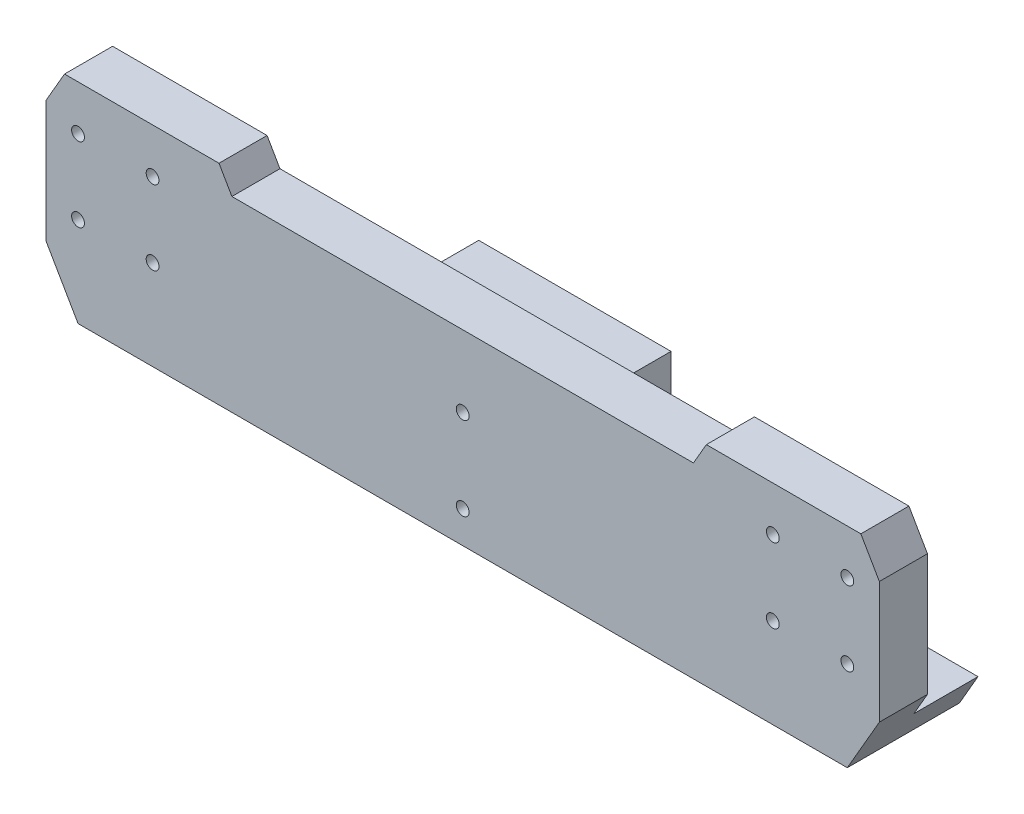
ISO-10303-21;
HEADER;
FILE_DESCRIPTION(('STEP AP214'),'2;1');
FILE_NAME('part.step','',(''),(''),'','','');
FILE_SCHEMA(('AUTOMOTIVE_DESIGN { 1 0 10303 214 1 1 1 1 }'));
ENDSEC;
DATA;
#1=APPLICATION_CONTEXT('core data for automotive mechanical design processes');
#2=APPLICATION_PROTOCOL_DEFINITION('international standard','automotive_design',2000,#1);
#3=PRODUCT_CONTEXT('',#1,'mechanical');
#4=PRODUCT('Part','Part','',(#3));
#5=PRODUCT_RELATED_PRODUCT_CATEGORY('part','',(#4));
#6=PRODUCT_DEFINITION_FORMATION('','',#4);
#7=PRODUCT_DEFINITION_CONTEXT('part definition',#1,'design');
#8=PRODUCT_DEFINITION('design','',#6,#7);
#9=PRODUCT_DEFINITION_SHAPE('','',#8);
#10=(LENGTH_UNIT() NAMED_UNIT(*) SI_UNIT(.MILLI.,.METRE.));
#11=(NAMED_UNIT(*) PLANE_ANGLE_UNIT() SI_UNIT($,.RADIAN.));
#12=(NAMED_UNIT(*) SI_UNIT($,.STERADIAN.) SOLID_ANGLE_UNIT());
#13=UNCERTAINTY_MEASURE_WITH_UNIT(LENGTH_MEASURE(1.E-05),#10,'distance_accuracy_value','');
#14=(GEOMETRIC_REPRESENTATION_CONTEXT(3) GLOBAL_UNCERTAINTY_ASSIGNED_CONTEXT((#13)) GLOBAL_UNIT_ASSIGNED_CONTEXT((#10,
#11,#12)) REPRESENTATION_CONTEXT('',''));
#15=CARTESIAN_POINT('',(0.,0.,0.));
#16=DIRECTION('',(0.,0.,1.));
#17=DIRECTION('',(1.,0.,0.));
#18=AXIS2_PLACEMENT_3D('',#15,#16,#17);
#19=CARTESIAN_POINT('',(0.,0.,0.));
#20=DIRECTION('',(0.,0.,1.));
#21=DIRECTION('',(1.,0.,0.));
#22=AXIS2_PLACEMENT_3D('',#19,#20,#21);
#23=PLANE('',#22);
#24=CARTESIAN_POINT('',(96.7500000000001,-30.2765187666378,0.));
#25=DIRECTION('',(0.,0.,1.));
#26=DIRECTION('',(1.,0.,0.));
#27=AXIS2_PLACEMENT_3D('',#24,#25,#26);
#28=CIRCLE('',#27,2.);
#29=CARTESIAN_POINT('',(98.7500000000001,-30.2765187666378,0.));
#30=VERTEX_POINT('',#29);
#31=EDGE_CURVE('E242',#30,#30,#28,.F.);
#32=ORIENTED_EDGE('',*,*,#31,.F.);
#33=EDGE_LOOP('',(#32));
#34=FACE_BOUND('',#33,.T.);
#35=CARTESIAN_POINT('',(120.,-30.2765187666379,0.));
#36=DIRECTION('',(0.,0.,1.));
#37=DIRECTION('',(1.,0.,0.));
#38=AXIS2_PLACEMENT_3D('',#35,#36,#37);
#39=CIRCLE('',#38,2.);
#40=CARTESIAN_POINT('',(122.,-30.2765187666379,0.));
#41=VERTEX_POINT('',#40);
#42=EDGE_CURVE('E238',#41,#41,#39,.F.);
#43=ORIENTED_EDGE('',*,*,#42,.F.);
#44=EDGE_LOOP('',(#43));
#45=FACE_BOUND('',#44,.T.);
#46=CARTESIAN_POINT('',(-120.,-7.02651876663782,0.));
#47=DIRECTION('',(0.,0.,1.));
#48=DIRECTION('',(1.,0.,0.));
#49=AXIS2_PLACEMENT_3D('',#46,#47,#48);
#50=CIRCLE('',#49,2.);
#51=CARTESIAN_POINT('',(-118.,-7.02651876663782,0.));
#52=VERTEX_POINT('',#51);
#53=EDGE_CURVE('E202',#52,#52,#50,.T.);
#54=ORIENTED_EDGE('',*,*,#53,.T.);
#55=EDGE_LOOP('',(#54));
#56=FACE_BOUND('',#55,.T.);
#57=CARTESIAN_POINT('',(-96.7499999999998,-7.02651876663804,0.));
#58=DIRECTION('',(0.,0.,1.));
#59=DIRECTION('',(1.,0.,0.));
#60=AXIS2_PLACEMENT_3D('',#57,#58,#59);
#61=CIRCLE('',#60,2.);
#62=CARTESIAN_POINT('',(-94.7499999999998,-7.02651876663804,0.));
#63=VERTEX_POINT('',#62);
#64=EDGE_CURVE('E198',#63,#63,#61,.T.);
#65=ORIENTED_EDGE('',*,*,#64,.T.);
#66=EDGE_LOOP('',(#65));
#67=FACE_BOUND('',#66,.T.);
#68=CARTESIAN_POINT('',(-96.7499999999998,-30.276518766638,0.));
#69=DIRECTION('',(0.,0.,1.));
#70=DIRECTION('',(1.,0.,0.));
#71=AXIS2_PLACEMENT_3D('',#68,#69,#70);
#72=CIRCLE('',#71,2.);
#73=CARTESIAN_POINT('',(-94.7499999999998,-30.276518766638,0.));
#74=VERTEX_POINT('',#73);
#75=EDGE_CURVE('E194',#74,#74,#72,.T.);
#76=ORIENTED_EDGE('',*,*,#75,.T.);
#77=EDGE_LOOP('',(#76));
#78=FACE_BOUND('',#77,.T.);
#79=CARTESIAN_POINT('',(-120.,-30.2765187666378,0.));
#80=DIRECTION('',(0.,0.,1.));
#81=DIRECTION('',(1.,0.,0.));
#82=AXIS2_PLACEMENT_3D('',#79,#80,#81);
#83=CIRCLE('',#82,2.);
#84=CARTESIAN_POINT('',(-118.,-30.2765187666378,0.));
#85=VERTEX_POINT('',#84);
#86=EDGE_CURVE('E190',#85,#85,#83,.T.);
#87=ORIENTED_EDGE('',*,*,#86,.T.);
#88=EDGE_LOOP('',(#87));
#89=FACE_BOUND('',#88,.T.);
#90=CARTESIAN_POINT('',(120.,-7.02651876663804,0.));
#91=DIRECTION('',(0.,0.,1.));
#92=DIRECTION('',(1.,0.,0.));
#93=AXIS2_PLACEMENT_3D('',#90,#91,#92);
#94=CIRCLE('',#93,2.);
#95=CARTESIAN_POINT('',(122.,-7.02651876663804,0.));
#96=VERTEX_POINT('',#95);
#97=EDGE_CURVE('E185',#96,#96,#94,.F.);
#98=ORIENTED_EDGE('',*,*,#97,.F.);
#99=EDGE_LOOP('',(#98));
#100=FACE_BOUND('',#99,.T.);
#101=CARTESIAN_POINT('',(96.7500000000001,-7.02651876663782,0.));
#102=DIRECTION('',(0.,0.,1.));
#103=DIRECTION('',(1.,0.,0.));
#104=AXIS2_PLACEMENT_3D('',#101,#102,#103);
#105=CIRCLE('',#104,2.);
#106=CARTESIAN_POINT('',(98.7500000000001,-7.02651876663782,0.));
#107=VERTEX_POINT('',#106);
#108=EDGE_CURVE('E181',#107,#107,#105,.F.);
#109=ORIENTED_EDGE('',*,*,#108,.F.);
#110=EDGE_LOOP('',(#109));
#111=FACE_BOUND('',#110,.T.);
#112=DIRECTION('',(1.,0.,0.));
#113=VECTOR('',#112,1.);
#114=CARTESIAN_POINT('',(2.4980018054066E-13,-48.3465187666375,0.));
#115=LINE('',#114,#113);
#116=CARTESIAN_POINT('',(-125.773502691895,-48.3465187666375,0.));
#117=VERTEX_POINT('',#116);
#118=CARTESIAN_POINT('',(-29.9999999999995,-48.3465187666375,0.));
#119=VERTEX_POINT('',#118);
#120=EDGE_CURVE('E11',#117,#119,#115,.T.);
#121=ORIENTED_EDGE('',*,*,#120,.F.);
#122=DIRECTION('',(0.499999999999941,-0.866025403784473,0.));
#123=VECTOR('',#122,1.);
#124=CARTESIAN_POINT('',(-115.264783737152,-66.5481539187184,0.));
#125=LINE('',#124,#123);
#126=CARTESIAN_POINT('',(-129.999999999999,-41.0260106909469,0.));
#127=VERTEX_POINT('',#126);
#128=EDGE_CURVE('E234',#127,#117,#125,.T.);
#129=ORIENTED_EDGE('',*,*,#128,.F.);
#130=DIRECTION('',(0.,-1.,0.));
#131=VECTOR('',#130,1.);
#132=CARTESIAN_POINT('',(-130.,0.,0.));
#133=LINE('',#132,#131);
#134=CARTESIAN_POINT('',(-130.,-3.02601069094666,0.));
#135=VERTEX_POINT('',#134);
#136=EDGE_CURVE('E107',#135,#127,#133,.T.);
#137=ORIENTED_EDGE('',*,*,#136,.F.);
#138=DIRECTION('',(-0.499999999999969,-0.866025403784457,0.));
#139=VECTOR('',#138,1.);
#140=CARTESIAN_POINT('',(-96.1896989347622,55.5351485732494,0.));
#141=LINE('',#140,#139);
#142=CARTESIAN_POINT('',(-124.22679064574,6.97348123336283,0.));
#143=VERTEX_POINT('',#142);
#144=EDGE_CURVE('E159',#143,#135,#141,.T.);
#145=ORIENTED_EDGE('',*,*,#144,.F.);
#146=DIRECTION('',(-1.,0.,0.));
#147=VECTOR('',#146,1.);
#148=CARTESIAN_POINT('',(0.,6.97348123336272,0.));
#149=LINE('',#148,#147);
#150=CARTESIAN_POINT('',(-76.0261412672698,6.97348123336256,0.));
#151=VERTEX_POINT('',#150);
#152=EDGE_CURVE('E227',#151,#143,#149,.T.);
#153=ORIENTED_EDGE('',*,*,#152,.F.);
#154=DIRECTION('',(-0.499999999999911,0.86602540378449,0.));
#155=VECTOR('',#154,1.);
#156=CARTESIAN_POINT('',(-54.0000000000064,-31.1769145362363,0.));
#157=LINE('',#156,#155);
#158=CARTESIAN_POINT('',(-71.9999999999999,-2.4980018054066E-13,0.));
#159=VERTEX_POINT('',#158);
#160=EDGE_CURVE('E224',#159,#151,#157,.T.);
#161=ORIENTED_EDGE('',*,*,#160,.F.);
#162=DIRECTION('',(-1.,0.,0.));
#163=VECTOR('',#162,1.);
#164=CARTESIAN_POINT('',(0.,0.,0.));
#165=LINE('',#164,#163);
#166=CARTESIAN_POINT('',(72.,0.,0.));
#167=VERTEX_POINT('',#166);
#168=EDGE_CURVE('E221',#167,#159,#165,.T.);
#169=ORIENTED_EDGE('',*,*,#168,.F.);
#170=DIRECTION('',(-0.499999999999999,-0.866025403784439,0.));
#171=VECTOR('',#170,1.);
#172=CARTESIAN_POINT('',(54.,-31.1769145362397,0.));
#173=LINE('',#172,#171);
#174=CARTESIAN_POINT('',(76.0261412672704,6.97348123336222,0.));
#175=VERTEX_POINT('',#174);
#176=EDGE_CURVE('E218',#175,#167,#173,.T.);
#177=ORIENTED_EDGE('',*,*,#176,.F.);
#178=DIRECTION('',(-1.,0.,0.));
#179=VECTOR('',#178,1.);
#180=CARTESIAN_POINT('',(0.,6.97348123336228,0.));
#181=LINE('',#180,#179);
#182=CARTESIAN_POINT('',(124.226790645741,6.97348123336194,0.));
#183=VERTEX_POINT('',#182);
#184=EDGE_CURVE('E215',#183,#175,#181,.T.);
#185=ORIENTED_EDGE('',*,*,#184,.F.);
#186=DIRECTION('',(-0.499999999999995,0.866025403784441,0.));
#187=VECTOR('',#186,1.);
#188=CARTESIAN_POINT('',(96.1896989347592,55.5351485732515,0.));
#189=LINE('',#188,#187);
#190=CARTESIAN_POINT('',(130.000000000001,-3.02601069094738,0.));
#191=VERTEX_POINT('',#190);
#192=EDGE_CURVE('E212',#191,#183,#189,.T.);
#193=ORIENTED_EDGE('',*,*,#192,.F.);
#194=DIRECTION('',(0.,1.,0.));
#195=VECTOR('',#194,1.);
#196=CARTESIAN_POINT('',(130.000000000001,-2.4980018054066E-13,0.));
#197=LINE('',#196,#195);
#198=CARTESIAN_POINT('',(130.000000000001,-41.0260106909474,0.));
#199=VERTEX_POINT('',#198);
#200=EDGE_CURVE('E209',#199,#191,#197,.T.);
#201=ORIENTED_EDGE('',*,*,#200,.F.);
#202=DIRECTION('',(0.499999999999995,0.866025403784442,0.));
#203=VECTOR('',#202,1.);
#204=CARTESIAN_POINT('',(115.264783737147,-66.5481539187251,0.));
#205=LINE('',#204,#203);
#206=CARTESIAN_POINT('',(125.773502691896,-48.3465187666374,0.));
#207=VERTEX_POINT('',#206);
#208=EDGE_CURVE('E206',#207,#199,#205,.T.);
#209=ORIENTED_EDGE('',*,*,#208,.F.);
#210=DIRECTION('',(-1.,0.,0.));
#211=VECTOR('',#210,1.);
#212=CARTESIAN_POINT('',(2.4980018054066E-13,-48.3465187666375,0.));
#213=LINE('',#212,#211);
#214=CARTESIAN_POINT('',(30.0000000000007,-48.3465187666375,0.));
#215=VERTEX_POINT('',#214);
#216=EDGE_CURVE('E285',#207,#215,#213,.T.);
#217=ORIENTED_EDGE('',*,*,#216,.T.);
#218=DIRECTION('',(0.,1.,0.));
#219=VECTOR('',#218,1.);
#220=CARTESIAN_POINT('',(30.0000000000005,0.,0.));
#221=LINE('',#220,#219);
#222=CARTESIAN_POINT('',(30.0000000000005,-8.34651876663722,0.));
#223=VERTEX_POINT('',#222);
#224=EDGE_CURVE('E289',#215,#223,#221,.T.);
#225=ORIENTED_EDGE('',*,*,#224,.T.);
#226=DIRECTION('',(1.,0.,0.));
#227=VECTOR('',#226,1.);
#228=CARTESIAN_POINT('',(0.,-8.34651876663722,0.));
#229=LINE('',#228,#227);
#230=CARTESIAN_POINT('',(-29.9999999999994,-8.34651876663744,0.));
#231=VERTEX_POINT('',#230);
#232=EDGE_CURVE('E293',#231,#223,#229,.T.);
#233=ORIENTED_EDGE('',*,*,#232,.F.);
#234=DIRECTION('',(0.,1.,0.));
#235=VECTOR('',#234,1.);
#236=CARTESIAN_POINT('',(-29.9999999999994,-2.4980018054066E-13,0.));
#237=LINE('',#236,#235);
#238=EDGE_CURVE('E51',#119,#231,#237,.T.);
#239=ORIENTED_EDGE('',*,*,#238,.F.);
#240=EDGE_LOOP('',(#121,#129,#137,#145,#153,#161,#169,#177,#185,#193,#201,#209,#217,#225,#233,#239));
#241=FACE_BOUND('',#240,.T.);
#242=ADVANCED_FACE('F42',(#34,#45,#56,#67,#78,#89,#100,#111,#241),#23,.F.);
#243=CARTESIAN_POINT('',(2.4980018054066E-13,-58.3465187666374,15.));
#244=DIRECTION('',(0.,1.,0.));
#245=DIRECTION('',(-1.,0.,0.));
#246=AXIS2_PLACEMENT_3D('',#243,#244,#245);
#247=PLANE('',#246);
#248=CARTESIAN_POINT('',(-72.,-58.3465187666374,-2.50000000000006));
#249=DIRECTION('',(0.,-1.,0.));
#250=DIRECTION('',(1.,0.,0.));
#251=AXIS2_PLACEMENT_3D('',#248,#249,#250);
#252=CIRCLE('',#251,2.);
#253=CARTESIAN_POINT('',(-70.,-58.3465187666374,-2.50000000000006));
#254=VERTEX_POINT('',#253);
#255=EDGE_CURVE('E507',#254,#254,#252,.T.);
#256=ORIENTED_EDGE('',*,*,#255,.F.);
#257=EDGE_LOOP('',(#256));
#258=FACE_BOUND('',#257,.T.);
#259=CARTESIAN_POINT('',(-42.,-58.3465187666374,-2.49999999999995));
#260=DIRECTION('',(0.,-1.,0.));
#261=DIRECTION('',(1.,0.,0.));
#262=AXIS2_PLACEMENT_3D('',#259,#260,#261);
#263=CIRCLE('',#262,2.);
#264=CARTESIAN_POINT('',(-40.,-58.3465187666374,-2.49999999999995));
#265=VERTEX_POINT('',#264);
#266=EDGE_CURVE('E499',#265,#265,#263,.T.);
#267=ORIENTED_EDGE('',*,*,#266,.F.);
#268=EDGE_LOOP('',(#267));
#269=FACE_BOUND('',#268,.T.);
#270=CARTESIAN_POINT('',(42.0000000000001,-58.3465187666374,-2.49999999999995));
#271=DIRECTION('',(0.,-1.,0.));
#272=DIRECTION('',(-1.,0.,0.));
#273=AXIS2_PLACEMENT_3D('',#270,#271,#272);
#274=CIRCLE('',#273,2.);
#275=CARTESIAN_POINT('',(40.0000000000001,-58.3465187666374,-2.49999999999995));
#276=VERTEX_POINT('',#275);
#277=EDGE_CURVE('E491',#276,#276,#274,.T.);
#278=ORIENTED_EDGE('',*,*,#277,.F.);
#279=EDGE_LOOP('',(#278));
#280=FACE_BOUND('',#279,.T.);
#281=CARTESIAN_POINT('',(72.,-58.3465187666374,-2.49999999999995));
#282=DIRECTION('',(0.,-1.,0.));
#283=DIRECTION('',(-1.,0.,0.));
#284=AXIS2_PLACEMENT_3D('',#281,#282,#283);
#285=CIRCLE('',#284,2.);
#286=CARTESIAN_POINT('',(70.,-58.3465187666374,-2.49999999999995));
#287=VERTEX_POINT('',#286);
#288=EDGE_CURVE('E483',#287,#287,#285,.T.);
#289=ORIENTED_EDGE('',*,*,#288,.F.);
#290=EDGE_LOOP('',(#289));
#291=FACE_BOUND('',#290,.T.);
#292=DIRECTION('',(0.,0.,-1.));
#293=VECTOR('',#292,1.);
#294=CARTESIAN_POINT('',(-120.,-58.3465187666374,15.));
#295=LINE('',#294,#293);
#296=CARTESIAN_POINT('',(-120.,-58.3465187666374,15.));
#297=VERTEX_POINT('',#296);
#298=CARTESIAN_POINT('',(-120.,-58.3465187666374,-20.));
#299=VERTEX_POINT('',#298);
#300=EDGE_CURVE('E180',#297,#299,#295,.T.);
#301=ORIENTED_EDGE('',*,*,#300,.T.);
#302=DIRECTION('',(1.,0.,0.));
#303=VECTOR('',#302,1.);
#304=CARTESIAN_POINT('',(2.4980018054066E-13,-58.3465187666374,-20.));
#305=LINE('',#304,#303);
#306=CARTESIAN_POINT('',(120.,-58.3465187666374,-20.));
#307=VERTEX_POINT('',#306);
#308=EDGE_CURVE('E452',#299,#307,#305,.T.);
#309=ORIENTED_EDGE('',*,*,#308,.T.);
#310=DIRECTION('',(0.,0.,-1.));
#311=VECTOR('',#310,1.);
#312=CARTESIAN_POINT('',(120.,-58.3465187666374,15.));
#313=LINE('',#312,#311);
#314=CARTESIAN_POINT('',(120.,-58.3465187666374,15.));
#315=VERTEX_POINT('',#314);
#316=EDGE_CURVE('E282',#315,#307,#313,.T.);
#317=ORIENTED_EDGE('',*,*,#316,.F.);
#318=DIRECTION('',(1.,0.,0.));
#319=VECTOR('',#318,1.);
#320=CARTESIAN_POINT('',(2.4980018054066E-13,-58.3465187666374,15.));
#321=LINE('',#320,#319);
#322=EDGE_CURVE('E381',#297,#315,#321,.T.);
#323=ORIENTED_EDGE('',*,*,#322,.F.);
#324=EDGE_LOOP('',(#301,#309,#317,#323));
#325=FACE_BOUND('',#324,.T.);
#326=ADVANCED_FACE('F526',(#258,#269,#280,#291,#325),#247,.F.);
#327=CARTESIAN_POINT('',(115.264783737147,-66.5481539187251,15.));
#328=DIRECTION('',(-0.866025403784442,0.499999999999994,0.));
#329=DIRECTION('',(-0.499999999999995,-0.866025403784442,0.));
#330=AXIS2_PLACEMENT_3D('',#327,#328,#329);
#331=PLANE('',#330);
#332=DIRECTION('',(0.,0.,-1.));
#333=VECTOR('',#332,1.);
#334=CARTESIAN_POINT('',(130.000000000001,-41.0260106909474,15.));
#335=LINE('',#334,#333);
#336=CARTESIAN_POINT('',(130.000000000001,-41.0260106909474,15.));
#337=VERTEX_POINT('',#336);
#338=EDGE_CURVE('E278',#337,#199,#335,.T.);
#339=ORIENTED_EDGE('',*,*,#338,.F.);
#340=DIRECTION('',(0.499999999999995,0.866025403784442,0.));
#341=VECTOR('',#340,1.);
#342=CARTESIAN_POINT('',(115.264783737147,-66.5481539187251,15.));
#343=LINE('',#342,#341);
#344=EDGE_CURVE('E116',#315,#337,#343,.T.);
#345=ORIENTED_EDGE('',*,*,#344,.F.);
#346=ORIENTED_EDGE('',*,*,#316,.T.);
#347=DIRECTION('',(0.499999999999995,0.866025403784442,0.));
#348=VECTOR('',#347,1.);
#349=CARTESIAN_POINT('',(115.264783737147,-66.5481539187251,-20.));
#350=LINE('',#349,#348);
#351=CARTESIAN_POINT('',(125.773502691896,-48.3465187666374,-20.));
#352=VERTEX_POINT('',#351);
#353=EDGE_CURVE('E474',#307,#352,#350,.T.);
#354=ORIENTED_EDGE('',*,*,#353,.T.);
#355=DIRECTION('',(0.,0.,1.));
#356=VECTOR('',#355,1.);
#357=CARTESIAN_POINT('',(125.773502691896,-48.3465187666374,-20.));
#358=LINE('',#357,#356);
#359=EDGE_CURVE('E342',#352,#207,#358,.T.);
#360=ORIENTED_EDGE('',*,*,#359,.T.);
#361=ORIENTED_EDGE('',*,*,#208,.T.);
#362=EDGE_LOOP('',(#339,#345,#346,#354,#360,#361));
#363=FACE_BOUND('',#362,.T.);
#364=ADVANCED_FACE('F529',(#363),#331,.F.);
#365=CARTESIAN_POINT('',(130.000000000001,-1.11022302462516E-13,15.));
#366=DIRECTION('',(-1.,0.,0.));
#367=DIRECTION('',(0.,0.,1.));
#368=AXIS2_PLACEMENT_3D('',#365,#366,#367);
#369=PLANE('',#368);
#370=ORIENTED_EDGE('',*,*,#200,.T.);
#371=DIRECTION('',(0.,0.,-1.));
#372=VECTOR('',#371,1.);
#373=CARTESIAN_POINT('',(130.000000000001,-3.02601069094738,15.));
#374=LINE('',#373,#372);
#375=CARTESIAN_POINT('',(130.000000000001,-3.02601069094738,15.));
#376=VERTEX_POINT('',#375);
#377=EDGE_CURVE('E274',#376,#191,#374,.T.);
#378=ORIENTED_EDGE('',*,*,#377,.F.);
#379=DIRECTION('',(0.,1.,0.));
#380=VECTOR('',#379,1.);
#381=CARTESIAN_POINT('',(130.000000000001,-1.11022302462516E-13,15.));
#382=LINE('',#381,#380);
#383=EDGE_CURVE('E386',#337,#376,#382,.T.);
#384=ORIENTED_EDGE('',*,*,#383,.F.);
#385=ORIENTED_EDGE('',*,*,#338,.T.);
#386=EDGE_LOOP('',(#370,#378,#384,#385));
#387=FACE_BOUND('',#386,.T.);
#388=ADVANCED_FACE('F598',(#387),#369,.F.);
#389=CARTESIAN_POINT('',(96.1896989347592,55.5351485732513,15.));
#390=DIRECTION('',(-0.866025403784441,-0.499999999999995,0.));
#391=DIRECTION('',(0.499999999999995,-0.866025403784441,0.));
#392=AXIS2_PLACEMENT_3D('',#389,#390,#391);
#393=PLANE('',#392);
#394=ORIENTED_EDGE('',*,*,#192,.T.);
#395=DIRECTION('',(0.,0.,-1.));
#396=VECTOR('',#395,1.);
#397=CARTESIAN_POINT('',(124.226790645741,6.97348123336206,15.));
#398=LINE('',#397,#396);
#399=CARTESIAN_POINT('',(124.226790645741,6.97348123336206,15.));
#400=VERTEX_POINT('',#399);
#401=EDGE_CURVE('E270',#400,#183,#398,.T.);
#402=ORIENTED_EDGE('',*,*,#401,.F.);
#403=DIRECTION('',(-0.499999999999995,0.866025403784441,0.));
#404=VECTOR('',#403,1.);
#405=CARTESIAN_POINT('',(96.1896989347592,55.5351485732513,15.));
#406=LINE('',#405,#404);
#407=EDGE_CURVE('E389',#376,#400,#406,.T.);
#408=ORIENTED_EDGE('',*,*,#407,.F.);
#409=ORIENTED_EDGE('',*,*,#377,.T.);
#410=EDGE_LOOP('',(#394,#402,#408,#409));
#411=FACE_BOUND('',#410,.T.);
#412=ADVANCED_FACE('F594',(#411),#393,.F.);
#413=CARTESIAN_POINT('',(0.,6.97348123336219,15.));
#414=DIRECTION('',(0.,-1.,0.));
#415=DIRECTION('',(1.,0.,0.));
#416=AXIS2_PLACEMENT_3D('',#413,#414,#415);
#417=PLANE('',#416);
#418=ORIENTED_EDGE('',*,*,#184,.T.);
#419=DIRECTION('',(0.,0.,-1.));
#420=VECTOR('',#419,1.);
#421=CARTESIAN_POINT('',(76.0261412672704,6.97348123336211,15.));
#422=LINE('',#421,#420);
#423=CARTESIAN_POINT('',(76.0261412672704,6.97348123336211,15.));
#424=VERTEX_POINT('',#423);
#425=EDGE_CURVE('E266',#424,#175,#422,.T.);
#426=ORIENTED_EDGE('',*,*,#425,.F.);
#427=DIRECTION('',(-1.,0.,0.));
#428=VECTOR('',#427,1.);
#429=CARTESIAN_POINT('',(0.,6.97348123336219,15.));
#430=LINE('',#429,#428);
#431=EDGE_CURVE('E392',#400,#424,#430,.T.);
#432=ORIENTED_EDGE('',*,*,#431,.F.);
#433=ORIENTED_EDGE('',*,*,#401,.T.);
#434=EDGE_LOOP('',(#418,#426,#432,#433));
#435=FACE_BOUND('',#434,.T.);
#436=ADVANCED_FACE('F590',(#435),#417,.F.);
#437=CARTESIAN_POINT('',(54.,-31.1769145362399,15.));
#438=DIRECTION('',(0.866025403784439,-0.499999999999999,0.));
#439=DIRECTION('',(0.499999999999999,0.866025403784439,0.));
#440=AXIS2_PLACEMENT_3D('',#437,#438,#439);
#441=PLANE('',#440);
#442=ORIENTED_EDGE('',*,*,#176,.T.);
#443=DIRECTION('',(0.,0.,-1.));
#444=VECTOR('',#443,1.);
#445=CARTESIAN_POINT('',(72.,-1.38777878078145E-13,15.));
#446=LINE('',#445,#444);
#447=CARTESIAN_POINT('',(72.,-1.38777878078145E-13,15.));
#448=VERTEX_POINT('',#447);
#449=EDGE_CURVE('E262',#448,#167,#446,.T.);
#450=ORIENTED_EDGE('',*,*,#449,.F.);
#451=DIRECTION('',(-0.499999999999999,-0.866025403784439,0.));
#452=VECTOR('',#451,1.);
#453=CARTESIAN_POINT('',(54.,-31.1769145362399,15.));
#454=LINE('',#453,#452);
#455=EDGE_CURVE('E395',#424,#448,#454,.T.);
#456=ORIENTED_EDGE('',*,*,#455,.F.);
#457=ORIENTED_EDGE('',*,*,#425,.T.);
#458=EDGE_LOOP('',(#442,#450,#456,#457));
#459=FACE_BOUND('',#458,.T.);
#460=ADVANCED_FACE('F585',(#459),#441,.F.);
#461=CARTESIAN_POINT('',(0.,-1.11022302462516E-13,15.));
#462=DIRECTION('',(0.,-1.,0.));
#463=DIRECTION('',(1.,0.,0.));
#464=AXIS2_PLACEMENT_3D('',#461,#462,#463);
#465=PLANE('',#464);
#466=ORIENTED_EDGE('',*,*,#168,.T.);
#467=DIRECTION('',(0.,0.,-1.));
#468=VECTOR('',#467,1.);
#469=CARTESIAN_POINT('',(-71.9999999999998,-3.60822483003176E-13,15.));
#470=LINE('',#469,#468);
#471=CARTESIAN_POINT('',(-71.9999999999998,-3.60822483003176E-13,15.));
#472=VERTEX_POINT('',#471);
#473=EDGE_CURVE('E258',#472,#159,#470,.T.);
#474=ORIENTED_EDGE('',*,*,#473,.F.);
#475=DIRECTION('',(-1.,0.,0.));
#476=VECTOR('',#475,1.);
#477=CARTESIAN_POINT('',(0.,-1.11022302462516E-13,15.));
#478=LINE('',#477,#476);
#479=EDGE_CURVE('E398',#448,#472,#478,.T.);
#480=ORIENTED_EDGE('',*,*,#479,.F.);
#481=ORIENTED_EDGE('',*,*,#449,.T.);
#482=EDGE_LOOP('',(#466,#474,#480,#481));
#483=FACE_BOUND('',#482,.T.);
#484=ADVANCED_FACE('F579',(#483),#465,.F.);
#485=CARTESIAN_POINT('',(-54.0000000000063,-31.1769145362364,15.));
#486=DIRECTION('',(-0.86602540378449,-0.499999999999911,0.));
#487=DIRECTION('',(0.499999999999911,-0.86602540378449,0.));
#488=AXIS2_PLACEMENT_3D('',#485,#486,#487);
#489=PLANE('',#488);
#490=ORIENTED_EDGE('',*,*,#160,.T.);
#491=DIRECTION('',(0.,0.,-1.));
#492=VECTOR('',#491,1.);
#493=CARTESIAN_POINT('',(-76.0261412672697,6.97348123336244,15.));
#494=LINE('',#493,#492);
#495=CARTESIAN_POINT('',(-76.0261412672697,6.97348123336244,15.));
#496=VERTEX_POINT('',#495);
#497=EDGE_CURVE('E254',#496,#151,#494,.T.);
#498=ORIENTED_EDGE('',*,*,#497,.F.);
#499=DIRECTION('',(-0.499999999999911,0.86602540378449,0.));
#500=VECTOR('',#499,1.);
#501=CARTESIAN_POINT('',(-54.0000000000063,-31.1769145362364,15.));
#502=LINE('',#501,#500);
#503=EDGE_CURVE('E401',#472,#496,#502,.T.);
#504=ORIENTED_EDGE('',*,*,#503,.F.);
#505=ORIENTED_EDGE('',*,*,#473,.T.);
#506=EDGE_LOOP('',(#490,#498,#504,#505));
#507=FACE_BOUND('',#506,.T.);
#508=ADVANCED_FACE('F575',(#507),#489,.F.);
#509=CARTESIAN_POINT('',(0.,6.97348123336261,15.));
#510=DIRECTION('',(0.,-1.,0.));
#511=DIRECTION('',(1.,0.,0.));
#512=AXIS2_PLACEMENT_3D('',#509,#510,#511);
#513=PLANE('',#512);
#514=ORIENTED_EDGE('',*,*,#152,.T.);
#515=DIRECTION('',(0.,0.,-1.));
#516=VECTOR('',#515,1.);
#517=CARTESIAN_POINT('',(-124.22679064574,6.97348123336272,15.));
#518=LINE('',#517,#516);
#519=CARTESIAN_POINT('',(-124.22679064574,6.97348123336272,15.));
#520=VERTEX_POINT('',#519);
#521=EDGE_CURVE('E161',#520,#143,#518,.T.);
#522=ORIENTED_EDGE('',*,*,#521,.F.);
#523=DIRECTION('',(-1.,0.,0.));
#524=VECTOR('',#523,1.);
#525=CARTESIAN_POINT('',(0.,6.97348123336261,15.));
#526=LINE('',#525,#524);
#527=EDGE_CURVE('E150',#496,#520,#526,.T.);
#528=ORIENTED_EDGE('',*,*,#527,.F.);
#529=ORIENTED_EDGE('',*,*,#497,.T.);
#530=EDGE_LOOP('',(#514,#522,#528,#529));
#531=FACE_BOUND('',#530,.T.);
#532=ADVANCED_FACE('F571',(#531),#513,.F.);
#533=CARTESIAN_POINT('',(-96.1896989347622,55.5351485732492,15.));
#534=DIRECTION('',(0.866025403784457,-0.499999999999969,0.));
#535=DIRECTION('',(0.499999999999969,0.866025403784457,0.));
#536=AXIS2_PLACEMENT_3D('',#533,#534,#535);
#537=PLANE('',#536);
#538=ORIENTED_EDGE('',*,*,#144,.T.);
#539=DIRECTION('',(0.,0.,-1.));
#540=VECTOR('',#539,1.);
#541=CARTESIAN_POINT('',(-129.999999999999,-3.02601069094677,15.));
#542=LINE('',#541,#540);
#543=CARTESIAN_POINT('',(-129.999999999999,-3.02601069094677,15.));
#544=VERTEX_POINT('',#543);
#545=EDGE_CURVE('E156',#544,#135,#542,.T.);
#546=ORIENTED_EDGE('',*,*,#545,.F.);
#547=DIRECTION('',(-0.499999999999969,-0.866025403784457,0.));
#548=VECTOR('',#547,1.);
#549=CARTESIAN_POINT('',(-96.1896989347622,55.5351485732492,15.));
#550=LINE('',#549,#548);
#551=EDGE_CURVE('E143',#520,#544,#550,.T.);
#552=ORIENTED_EDGE('',*,*,#551,.F.);
#553=ORIENTED_EDGE('',*,*,#521,.T.);
#554=EDGE_LOOP('',(#538,#546,#552,#553));
#555=FACE_BOUND('',#554,.T.);
#556=ADVANCED_FACE('F157',(#555),#537,.F.);
#557=CARTESIAN_POINT('',(-129.999999999999,-1.11022302462516E-13,15.));
#558=DIRECTION('',(1.,0.,0.));
#559=DIRECTION('',(0.,0.,-1.));
#560=AXIS2_PLACEMENT_3D('',#557,#558,#559);
#561=PLANE('',#560);
#562=ORIENTED_EDGE('',*,*,#136,.T.);
#563=DIRECTION('',(0.,0.,-1.));
#564=VECTOR('',#563,1.);
#565=CARTESIAN_POINT('',(-129.999999999999,-41.0260106909469,15.));
#566=LINE('',#565,#564);
#567=CARTESIAN_POINT('',(-129.999999999999,-41.0260106909469,15.));
#568=VERTEX_POINT('',#567);
#569=EDGE_CURVE('E162',#568,#127,#566,.T.);
#570=ORIENTED_EDGE('',*,*,#569,.F.);
#571=DIRECTION('',(0.,-1.,0.));
#572=VECTOR('',#571,1.);
#573=CARTESIAN_POINT('',(-129.999999999999,-1.11022302462516E-13,15.));
#574=LINE('',#573,#572);
#575=EDGE_CURVE('E148',#544,#568,#574,.T.);
#576=ORIENTED_EDGE('',*,*,#575,.F.);
#577=ORIENTED_EDGE('',*,*,#545,.T.);
#578=EDGE_LOOP('',(#562,#570,#576,#577));
#579=FACE_BOUND('',#578,.T.);
#580=ADVANCED_FACE('F164',(#579),#561,.F.);
#581=CARTESIAN_POINT('',(120.,-30.2765187666379,15.));
#582=DIRECTION('',(0.,0.,-1.));
#583=DIRECTION('',(-1.,0.,0.));
#584=AXIS2_PLACEMENT_3D('',#581,#582,#583);
#585=CYLINDRICAL_SURFACE('',#584,2.);
#586=CARTESIAN_POINT('',(120.,-30.2765187666379,15.));
#587=DIRECTION('',(0.,0.,1.));
#588=DIRECTION('',(1.,0.,0.));
#589=AXIS2_PLACEMENT_3D('',#586,#587,#588);
#590=CIRCLE('',#589,2.);
#591=CARTESIAN_POINT('',(122.,-30.2765187666379,15.));
#592=VERTEX_POINT('',#591);
#593=EDGE_CURVE('E169',#592,#592,#590,.F.);
#594=ORIENTED_EDGE('',*,*,#593,.F.);
#595=EDGE_LOOP('',(#594));
#596=FACE_BOUND('',#595,.T.);
#597=ORIENTED_EDGE('',*,*,#42,.T.);
#598=EDGE_LOOP('',(#597));
#599=FACE_BOUND('',#598,.T.);
#600=ADVANCED_FACE('F622',(#596,#599),#585,.F.);
#601=CARTESIAN_POINT('',(-115.264783737152,-66.5481539187184,15.));
#602=DIRECTION('',(0.866025403784472,0.499999999999941,0.));
#603=DIRECTION('',(-0.499999999999941,0.866025403784473,0.));
#604=AXIS2_PLACEMENT_3D('',#601,#602,#603);
#605=PLANE('',#604);
#606=ORIENTED_EDGE('',*,*,#300,.F.);
#607=DIRECTION('',(0.499999999999941,-0.866025403784473,0.));
#608=VECTOR('',#607,1.);
#609=CARTESIAN_POINT('',(-115.264783737152,-66.5481539187184,15.));
#610=LINE('',#609,#608);
#611=EDGE_CURVE('E67',#568,#297,#610,.T.);
#612=ORIENTED_EDGE('',*,*,#611,.F.);
#613=ORIENTED_EDGE('',*,*,#569,.T.);
#614=ORIENTED_EDGE('',*,*,#128,.T.);
#615=DIRECTION('',(0.,0.,1.));
#616=VECTOR('',#615,1.);
#617=CARTESIAN_POINT('',(-125.773502691895,-48.3465187666375,-20.));
#618=LINE('',#617,#616);
#619=CARTESIAN_POINT('',(-125.773502691895,-48.3465187666375,-20.));
#620=VERTEX_POINT('',#619);
#621=EDGE_CURVE('E186',#620,#117,#618,.T.);
#622=ORIENTED_EDGE('',*,*,#621,.F.);
#623=DIRECTION('',(0.499999999999941,-0.866025403784473,0.));
#624=VECTOR('',#623,1.);
#625=CARTESIAN_POINT('',(-115.264783737152,-66.5481539187184,-20.));
#626=LINE('',#625,#624);
#627=EDGE_CURVE('E456',#620,#299,#626,.T.);
#628=ORIENTED_EDGE('',*,*,#627,.T.);
#629=EDGE_LOOP('',(#606,#612,#613,#614,#622,#628));
#630=FACE_BOUND('',#629,.T.);
#631=ADVANCED_FACE('F547',(#630),#605,.F.);
#632=CARTESIAN_POINT('',(-120.,-7.02651876663793,15.));
#633=DIRECTION('',(0.,0.,-1.));
#634=DIRECTION('',(-1.,0.,0.));
#635=AXIS2_PLACEMENT_3D('',#632,#633,#634);
#636=CYLINDRICAL_SURFACE('',#635,2.);
#637=CARTESIAN_POINT('',(-120.,-7.02651876663793,15.));
#638=DIRECTION('',(0.,0.,1.));
#639=DIRECTION('',(1.,0.,0.));
#640=AXIS2_PLACEMENT_3D('',#637,#638,#639);
#641=CIRCLE('',#640,2.);
#642=CARTESIAN_POINT('',(-118.,-7.02651876663793,15.));
#643=VERTEX_POINT('',#642);
#644=EDGE_CURVE('E377',#643,#643,#641,.T.);
#645=ORIENTED_EDGE('',*,*,#644,.T.);
#646=EDGE_LOOP('',(#645));
#647=FACE_BOUND('',#646,.T.);
#648=ORIENTED_EDGE('',*,*,#53,.F.);
#649=EDGE_LOOP('',(#648));
#650=FACE_BOUND('',#649,.T.);
#651=ADVANCED_FACE('F628',(#647,#650),#636,.F.);
#652=CARTESIAN_POINT('',(-96.7499999999998,-7.02651876663793,15.));
#653=DIRECTION('',(0.,0.,-1.));
#654=DIRECTION('',(-1.,0.,0.));
#655=AXIS2_PLACEMENT_3D('',#652,#653,#654);
#656=CYLINDRICAL_SURFACE('',#655,2.);
#657=CARTESIAN_POINT('',(-96.7499999999998,-7.02651876663793,15.));
#658=DIRECTION('',(0.,0.,1.));
#659=DIRECTION('',(1.,0.,0.));
#660=AXIS2_PLACEMENT_3D('',#657,#658,#659);
#661=CIRCLE('',#660,2.);
#662=CARTESIAN_POINT('',(-94.7499999999998,-7.02651876663793,15.));
#663=VERTEX_POINT('',#662);
#664=EDGE_CURVE('E373',#663,#663,#661,.T.);
#665=ORIENTED_EDGE('',*,*,#664,.T.);
#666=EDGE_LOOP('',(#665));
#667=FACE_BOUND('',#666,.T.);
#668=ORIENTED_EDGE('',*,*,#64,.F.);
#669=EDGE_LOOP('',(#668));
#670=FACE_BOUND('',#669,.T.);
#671=ADVANCED_FACE('F684',(#667,#670),#656,.F.);
#672=CARTESIAN_POINT('',(-96.7499999999998,-30.276518766638,15.));
#673=DIRECTION('',(0.,0.,-1.));
#674=DIRECTION('',(-1.,0.,0.));
#675=AXIS2_PLACEMENT_3D('',#672,#673,#674);
#676=CYLINDRICAL_SURFACE('',#675,2.);
#677=CARTESIAN_POINT('',(-96.7499999999998,-30.276518766638,15.));
#678=DIRECTION('',(0.,0.,1.));
#679=DIRECTION('',(1.,0.,0.));
#680=AXIS2_PLACEMENT_3D('',#677,#678,#679);
#681=CIRCLE('',#680,2.);
#682=CARTESIAN_POINT('',(-94.7499999999998,-30.276518766638,15.));
#683=VERTEX_POINT('',#682);
#684=EDGE_CURVE('E369',#683,#683,#681,.T.);
#685=ORIENTED_EDGE('',*,*,#684,.T.);
#686=EDGE_LOOP('',(#685));
#687=FACE_BOUND('',#686,.T.);
#688=ORIENTED_EDGE('',*,*,#75,.F.);
#689=EDGE_LOOP('',(#688));
#690=FACE_BOUND('',#689,.T.);
#691=ADVANCED_FACE('F692',(#687,#690),#676,.F.);
#692=CARTESIAN_POINT('',(-120.,-30.2765187666379,15.));
#693=DIRECTION('',(0.,0.,-1.));
#694=DIRECTION('',(-1.,0.,0.));
#695=AXIS2_PLACEMENT_3D('',#692,#693,#694);
#696=CYLINDRICAL_SURFACE('',#695,2.);
#697=CARTESIAN_POINT('',(-120.,-30.2765187666379,15.));
#698=DIRECTION('',(0.,0.,1.));
#699=DIRECTION('',(1.,0.,0.));
#700=AXIS2_PLACEMENT_3D('',#697,#698,#699);
#701=CIRCLE('',#700,2.);
#702=CARTESIAN_POINT('',(-118.,-30.2765187666379,15.));
#703=VERTEX_POINT('',#702);
#704=EDGE_CURVE('E365',#703,#703,#701,.T.);
#705=ORIENTED_EDGE('',*,*,#704,.T.);
#706=EDGE_LOOP('',(#705));
#707=FACE_BOUND('',#706,.T.);
#708=ORIENTED_EDGE('',*,*,#86,.F.);
#709=EDGE_LOOP('',(#708));
#710=FACE_BOUND('',#709,.T.);
#711=ADVANCED_FACE('F700',(#707,#710),#696,.F.);
#712=CARTESIAN_POINT('',(120.,-7.02651876663793,15.));
#713=DIRECTION('',(0.,0.,-1.));
#714=DIRECTION('',(-1.,0.,0.));
#715=AXIS2_PLACEMENT_3D('',#712,#713,#714);
#716=CYLINDRICAL_SURFACE('',#715,2.);
#717=CARTESIAN_POINT('',(120.,-7.02651876663793,15.));
#718=DIRECTION('',(0.,0.,1.));
#719=DIRECTION('',(1.,0.,0.));
#720=AXIS2_PLACEMENT_3D('',#717,#718,#719);
#721=CIRCLE('',#720,2.);
#722=CARTESIAN_POINT('',(122.,-7.02651876663793,15.));
#723=VERTEX_POINT('',#722);
#724=EDGE_CURVE('E361',#723,#723,#721,.F.);
#725=ORIENTED_EDGE('',*,*,#724,.F.);
#726=EDGE_LOOP('',(#725));
#727=FACE_BOUND('',#726,.T.);
#728=ORIENTED_EDGE('',*,*,#97,.T.);
#729=EDGE_LOOP('',(#728));
#730=FACE_BOUND('',#729,.T.);
#731=ADVANCED_FACE('F708',(#727,#730),#716,.F.);
#732=CARTESIAN_POINT('',(96.7500000000001,-7.02651876663793,15.));
#733=DIRECTION('',(0.,0.,-1.));
#734=DIRECTION('',(-1.,0.,0.));
#735=AXIS2_PLACEMENT_3D('',#732,#733,#734);
#736=CYLINDRICAL_SURFACE('',#735,2.);
#737=CARTESIAN_POINT('',(96.7500000000001,-7.02651876663793,15.));
#738=DIRECTION('',(0.,0.,1.));
#739=DIRECTION('',(1.,0.,0.));
#740=AXIS2_PLACEMENT_3D('',#737,#738,#739);
#741=CIRCLE('',#740,2.);
#742=CARTESIAN_POINT('',(98.7500000000001,-7.02651876663793,15.));
#743=VERTEX_POINT('',#742);
#744=EDGE_CURVE('E357',#743,#743,#741,.F.);
#745=ORIENTED_EDGE('',*,*,#744,.F.);
#746=EDGE_LOOP('',(#745));
#747=FACE_BOUND('',#746,.T.);
#748=ORIENTED_EDGE('',*,*,#108,.T.);
#749=EDGE_LOOP('',(#748));
#750=FACE_BOUND('',#749,.T.);
#751=ADVANCED_FACE('F716',(#747,#750),#736,.F.);
#752=CARTESIAN_POINT('',(3.33066907387547E-13,-48.3465187666375,15.));
#753=DIRECTION('',(0.,0.,-1.));
#754=DIRECTION('',(-1.,0.,0.));
#755=AXIS2_PLACEMENT_3D('',#752,#753,#754);
#756=CYLINDRICAL_SURFACE('',#755,2.);
#757=CARTESIAN_POINT('',(3.33066907387547E-13,-48.3465187666375,15.));
#758=DIRECTION('',(0.,0.,1.));
#759=DIRECTION('',(1.,0.,0.));
#760=AXIS2_PLACEMENT_3D('',#757,#758,#759);
#761=CIRCLE('',#760,2.);
#762=CARTESIAN_POINT('',(2.00000000000034,-48.3465187666375,15.));
#763=VERTEX_POINT('',#762);
#764=EDGE_CURVE('E353',#763,#763,#761,.T.);
#765=ORIENTED_EDGE('',*,*,#764,.T.);
#766=EDGE_LOOP('',(#765));
#767=FACE_BOUND('',#766,.T.);
#768=CARTESIAN_POINT('',(3.33066907387547E-13,-48.3465187666375,-20.));
#769=DIRECTION('',(0.,0.,1.));
#770=DIRECTION('',(1.,0.,0.));
#771=AXIS2_PLACEMENT_3D('',#768,#769,#770);
#772=CIRCLE('',#771,2.);
#773=CARTESIAN_POINT('',(2.00000000000034,-48.3465187666375,-20.));
#774=VERTEX_POINT('',#773);
#775=EDGE_CURVE('E478',#774,#774,#772,.F.);
#776=ORIENTED_EDGE('',*,*,#775,.T.);
#777=EDGE_LOOP('',(#776));
#778=FACE_BOUND('',#777,.T.);
#779=ADVANCED_FACE('F724',(#767,#778),#756,.F.);
#780=CARTESIAN_POINT('',(0.,-22.3465187666373,15.));
#781=DIRECTION('',(0.,0.,-1.));
#782=DIRECTION('',(-1.,0.,0.));
#783=AXIS2_PLACEMENT_3D('',#780,#781,#782);
#784=CYLINDRICAL_SURFACE('',#783,2.);
#785=CARTESIAN_POINT('',(0.,-22.3465187666373,15.));
#786=DIRECTION('',(0.,0.,1.));
#787=DIRECTION('',(1.,0.,0.));
#788=AXIS2_PLACEMENT_3D('',#785,#786,#787);
#789=CIRCLE('',#788,2.);
#790=CARTESIAN_POINT('',(2.00000000000009,-22.3465187666373,15.));
#791=VERTEX_POINT('',#790);
#792=EDGE_CURVE('E246',#791,#791,#789,.T.);
#793=ORIENTED_EDGE('',*,*,#792,.T.);
#794=EDGE_LOOP('',(#793));
#795=FACE_BOUND('',#794,.T.);
#796=CARTESIAN_POINT('',(0.,-22.3465187666372,-20.));
#797=DIRECTION('',(0.,0.,1.));
#798=DIRECTION('',(1.,0.,0.));
#799=AXIS2_PLACEMENT_3D('',#796,#797,#798);
#800=CIRCLE('',#799,2.);
#801=CARTESIAN_POINT('',(2.00000000000009,-22.3465187666372,-20.));
#802=VERTEX_POINT('',#801);
#803=EDGE_CURVE('E349',#802,#802,#800,.F.);
#804=ORIENTED_EDGE('',*,*,#803,.T.);
#805=EDGE_LOOP('',(#804));
#806=FACE_BOUND('',#805,.T.);
#807=ADVANCED_FACE('F44',(#795,#806),#784,.F.);
#808=CARTESIAN_POINT('',(96.7500000000001,-30.2765187666379,15.));
#809=DIRECTION('',(0.,0.,-1.));
#810=DIRECTION('',(-1.,0.,0.));
#811=AXIS2_PLACEMENT_3D('',#808,#809,#810);
#812=CYLINDRICAL_SURFACE('',#811,2.);
#813=CARTESIAN_POINT('',(96.7500000000001,-30.2765187666379,15.));
#814=DIRECTION('',(0.,0.,1.));
#815=DIRECTION('',(1.,0.,0.));
#816=AXIS2_PLACEMENT_3D('',#813,#814,#815);
#817=CIRCLE('',#816,2.);
#818=CARTESIAN_POINT('',(98.7500000000001,-30.2765187666379,15.));
#819=VERTEX_POINT('',#818);
#820=EDGE_CURVE('E176',#819,#819,#817,.F.);
#821=ORIENTED_EDGE('',*,*,#820,.F.);
#822=EDGE_LOOP('',(#821));
#823=FACE_BOUND('',#822,.T.);
#824=ORIENTED_EDGE('',*,*,#31,.T.);
#825=EDGE_LOOP('',(#824));
#826=FACE_BOUND('',#825,.T.);
#827=ADVANCED_FACE('F618',(#823,#826),#812,.F.);
#828=CARTESIAN_POINT('',(0.,-1.11022302462516E-13,15.));
#829=DIRECTION('',(0.,0.,1.));
#830=DIRECTION('',(1.,0.,0.));
#831=AXIS2_PLACEMENT_3D('',#828,#829,#830);
#832=PLANE('',#831);
#833=ORIENTED_EDGE('',*,*,#611,.T.);
#834=ORIENTED_EDGE('',*,*,#322,.T.);
#835=ORIENTED_EDGE('',*,*,#344,.T.);
#836=ORIENTED_EDGE('',*,*,#383,.T.);
#837=ORIENTED_EDGE('',*,*,#407,.T.);
#838=ORIENTED_EDGE('',*,*,#431,.T.);
#839=ORIENTED_EDGE('',*,*,#455,.T.);
#840=ORIENTED_EDGE('',*,*,#479,.T.);
#841=ORIENTED_EDGE('',*,*,#503,.T.);
#842=ORIENTED_EDGE('',*,*,#527,.T.);
#843=ORIENTED_EDGE('',*,*,#551,.T.);
#844=ORIENTED_EDGE('',*,*,#575,.T.);
#845=EDGE_LOOP('',(#833,#834,#835,#836,#837,#838,#839,#840,#841,#842,#843,#844));
#846=FACE_BOUND('',#845,.T.);
#847=ORIENTED_EDGE('',*,*,#792,.F.);
#848=EDGE_LOOP('',(#847));
#849=FACE_BOUND('',#848,.T.);
#850=ORIENTED_EDGE('',*,*,#764,.F.);
#851=EDGE_LOOP('',(#850));
#852=FACE_BOUND('',#851,.T.);
#853=ORIENTED_EDGE('',*,*,#820,.T.);
#854=EDGE_LOOP('',(#853));
#855=FACE_BOUND('',#854,.T.);
#856=ORIENTED_EDGE('',*,*,#593,.T.);
#857=EDGE_LOOP('',(#856));
#858=FACE_BOUND('',#857,.T.);
#859=ORIENTED_EDGE('',*,*,#644,.F.);
#860=EDGE_LOOP('',(#859));
#861=FACE_BOUND('',#860,.T.);
#862=ORIENTED_EDGE('',*,*,#664,.F.);
#863=EDGE_LOOP('',(#862));
#864=FACE_BOUND('',#863,.T.);
#865=ORIENTED_EDGE('',*,*,#684,.F.);
#866=EDGE_LOOP('',(#865));
#867=FACE_BOUND('',#866,.T.);
#868=ORIENTED_EDGE('',*,*,#704,.F.);
#869=EDGE_LOOP('',(#868));
#870=FACE_BOUND('',#869,.T.);
#871=ORIENTED_EDGE('',*,*,#724,.T.);
#872=EDGE_LOOP('',(#871));
#873=FACE_BOUND('',#872,.T.);
#874=ORIENTED_EDGE('',*,*,#744,.T.);
#875=EDGE_LOOP('',(#874));
#876=FACE_BOUND('',#875,.T.);
#877=ADVANCED_FACE('F145',(#846,#849,#852,#855,#858,#861,#864,#867,#870,#873,#876),#832,.T.);
#878=CARTESIAN_POINT('',(2.4980018054066E-13,-48.3465187666375,-20.));
#879=DIRECTION('',(0.,-1.,0.));
#880=DIRECTION('',(0.,0.,-1.));
#881=AXIS2_PLACEMENT_3D('',#878,#879,#880);
#882=PLANE('',#881);
#883=CARTESIAN_POINT('',(-71.9999999999999,-48.3465187666374,-2.50000000000006));
#884=DIRECTION('',(0.,-1.,0.));
#885=DIRECTION('',(1.,0.,0.));
#886=AXIS2_PLACEMENT_3D('',#883,#884,#885);
#887=CIRCLE('',#886,2.);
#888=CARTESIAN_POINT('',(-69.9999999999999,-48.3465187666374,-2.50000000000006));
#889=VERTEX_POINT('',#888);
#890=EDGE_CURVE('E482',#889,#889,#887,.T.);
#891=ORIENTED_EDGE('',*,*,#890,.T.);
#892=EDGE_LOOP('',(#891));
#893=FACE_BOUND('',#892,.T.);
#894=CARTESIAN_POINT('',(-42.,-48.3465187666374,-2.49999999999995));
#895=DIRECTION('',(0.,-1.,0.));
#896=DIRECTION('',(1.,0.,0.));
#897=AXIS2_PLACEMENT_3D('',#894,#895,#896);
#898=CIRCLE('',#897,2.);
#899=CARTESIAN_POINT('',(-40.,-48.3465187666374,-2.49999999999995));
#900=VERTEX_POINT('',#899);
#901=EDGE_CURVE('E503',#900,#900,#898,.T.);
#902=ORIENTED_EDGE('',*,*,#901,.T.);
#903=EDGE_LOOP('',(#902));
#904=FACE_BOUND('',#903,.T.);
#905=ORIENTED_EDGE('',*,*,#621,.T.);
#906=ORIENTED_EDGE('',*,*,#120,.T.);
#907=DIRECTION('',(0.,0.,1.));
#908=VECTOR('',#907,1.);
#909=CARTESIAN_POINT('',(-29.9999999999994,-48.3465187666375,-20.));
#910=LINE('',#909,#908);
#911=CARTESIAN_POINT('',(-29.9999999999994,-48.3465187666375,-20.));
#912=VERTEX_POINT('',#911);
#913=EDGE_CURVE('E311',#912,#119,#910,.T.);
#914=ORIENTED_EDGE('',*,*,#913,.F.);
#915=DIRECTION('',(1.,0.,0.));
#916=VECTOR('',#915,1.);
#917=CARTESIAN_POINT('',(2.4980018054066E-13,-48.3465187666375,-20.));
#918=LINE('',#917,#916);
#919=EDGE_CURVE('E460',#620,#912,#918,.T.);
#920=ORIENTED_EDGE('',*,*,#919,.F.);
#921=EDGE_LOOP('',(#905,#906,#914,#920));
#922=FACE_BOUND('',#921,.T.);
#923=ADVANCED_FACE('F516',(#893,#904,#922),#882,.F.);
#924=CARTESIAN_POINT('',(-29.9999999999994,-2.4980018054066E-13,-20.));
#925=DIRECTION('',(1.,0.,0.));
#926=DIRECTION('',(0.,0.,-1.));
#927=AXIS2_PLACEMENT_3D('',#924,#925,#926);
#928=PLANE('',#927);
#929=ORIENTED_EDGE('',*,*,#913,.T.);
#930=ORIENTED_EDGE('',*,*,#238,.T.);
#931=DIRECTION('',(0.,0.,1.));
#932=VECTOR('',#931,1.);
#933=CARTESIAN_POINT('',(-29.9999999999994,-8.34651876663747,-20.));
#934=LINE('',#933,#932);
#935=CARTESIAN_POINT('',(-29.9999999999994,-8.34651876663747,-20.));
#936=VERTEX_POINT('',#935);
#937=EDGE_CURVE('E308',#936,#231,#934,.T.);
#938=ORIENTED_EDGE('',*,*,#937,.F.);
#939=DIRECTION('',(0.,1.,0.));
#940=VECTOR('',#939,1.);
#941=CARTESIAN_POINT('',(-29.9999999999994,-2.4980018054066E-13,-20.));
#942=LINE('',#941,#940);
#943=EDGE_CURVE('E464',#912,#936,#942,.T.);
#944=ORIENTED_EDGE('',*,*,#943,.F.);
#945=EDGE_LOOP('',(#929,#930,#938,#944));
#946=FACE_BOUND('',#945,.T.);
#947=ADVANCED_FACE('F305',(#946),#928,.F.);
#948=CARTESIAN_POINT('',(0.,-8.34651876663722,-20.));
#949=DIRECTION('',(0.,-1.,0.));
#950=DIRECTION('',(0.,0.,-1.));
#951=AXIS2_PLACEMENT_3D('',#948,#949,#950);
#952=PLANE('',#951);
#953=ORIENTED_EDGE('',*,*,#937,.T.);
#954=ORIENTED_EDGE('',*,*,#232,.T.);
#955=DIRECTION('',(0.,0.,1.));
#956=VECTOR('',#955,1.);
#957=CARTESIAN_POINT('',(30.0000000000005,-8.34651876663722,-20.));
#958=LINE('',#957,#956);
#959=CARTESIAN_POINT('',(30.0000000000005,-8.34651876663722,-20.));
#960=VERTEX_POINT('',#959);
#961=EDGE_CURVE('E326',#960,#223,#958,.T.);
#962=ORIENTED_EDGE('',*,*,#961,.F.);
#963=DIRECTION('',(1.,0.,0.));
#964=VECTOR('',#963,1.);
#965=CARTESIAN_POINT('',(0.,-8.34651876663722,-20.));
#966=LINE('',#965,#964);
#967=EDGE_CURVE('E323',#936,#960,#966,.T.);
#968=ORIENTED_EDGE('',*,*,#967,.F.);
#969=EDGE_LOOP('',(#953,#954,#962,#968));
#970=FACE_BOUND('',#969,.T.);
#971=ADVANCED_FACE('F319',(#970),#952,.F.);
#972=CARTESIAN_POINT('',(30.0000000000005,0.,-20.));
#973=DIRECTION('',(1.,0.,0.));
#974=DIRECTION('',(0.,1.,0.));
#975=AXIS2_PLACEMENT_3D('',#972,#973,#974);
#976=PLANE('',#975);
#977=ORIENTED_EDGE('',*,*,#224,.F.);
#978=DIRECTION('',(0.,0.,1.));
#979=VECTOR('',#978,1.);
#980=CARTESIAN_POINT('',(30.0000000000007,-48.3465187666375,-20.));
#981=LINE('',#980,#979);
#982=CARTESIAN_POINT('',(30.0000000000007,-48.3465187666375,-20.));
#983=VERTEX_POINT('',#982);
#984=EDGE_CURVE('E58',#983,#215,#981,.T.);
#985=ORIENTED_EDGE('',*,*,#984,.F.);
#986=DIRECTION('',(0.,1.,0.));
#987=VECTOR('',#986,1.);
#988=CARTESIAN_POINT('',(30.0000000000005,0.,-20.));
#989=LINE('',#988,#987);
#990=EDGE_CURVE('E337',#983,#960,#989,.T.);
#991=ORIENTED_EDGE('',*,*,#990,.T.);
#992=ORIENTED_EDGE('',*,*,#961,.T.);
#993=EDGE_LOOP('',(#977,#985,#991,#992));
#994=FACE_BOUND('',#993,.T.);
#995=ADVANCED_FACE('F332',(#994),#976,.T.);
#996=CARTESIAN_POINT('',(2.4980018054066E-13,-48.3465187666375,-20.));
#997=DIRECTION('',(0.,1.,0.));
#998=DIRECTION('',(-1.,0.,0.));
#999=AXIS2_PLACEMENT_3D('',#996,#997,#998);
#1000=PLANE('',#999);
#1001=CARTESIAN_POINT('',(42.0000000000001,-48.3465187666374,-2.49999999999995));
#1002=DIRECTION('',(0.,-1.,0.));
#1003=DIRECTION('',(-1.,0.,0.));
#1004=AXIS2_PLACEMENT_3D('',#1001,#1002,#1003);
#1005=CIRCLE('',#1004,2.);
#1006=CARTESIAN_POINT('',(40.0000000000001,-48.3465187666374,-2.49999999999995));
#1007=VERTEX_POINT('',#1006);
#1008=EDGE_CURVE('E495',#1007,#1007,#1005,.T.);
#1009=ORIENTED_EDGE('',*,*,#1008,.T.);
#1010=EDGE_LOOP('',(#1009));
#1011=FACE_BOUND('',#1010,.T.);
#1012=CARTESIAN_POINT('',(72.0000000000002,-48.3465187666374,-2.49999999999995));
#1013=DIRECTION('',(0.,-1.,0.));
#1014=DIRECTION('',(-1.,0.,0.));
#1015=AXIS2_PLACEMENT_3D('',#1012,#1013,#1014);
#1016=CIRCLE('',#1015,2.);
#1017=CARTESIAN_POINT('',(70.0000000000002,-48.3465187666374,-2.49999999999995));
#1018=VERTEX_POINT('',#1017);
#1019=EDGE_CURVE('E487',#1018,#1018,#1016,.T.);
#1020=ORIENTED_EDGE('',*,*,#1019,.T.);
#1021=EDGE_LOOP('',(#1020));
#1022=FACE_BOUND('',#1021,.T.);
#1023=ORIENTED_EDGE('',*,*,#216,.F.);
#1024=ORIENTED_EDGE('',*,*,#359,.F.);
#1025=DIRECTION('',(-1.,0.,0.));
#1026=VECTOR('',#1025,1.);
#1027=CARTESIAN_POINT('',(2.4980018054066E-13,-48.3465187666375,-20.));
#1028=LINE('',#1027,#1026);
#1029=EDGE_CURVE('E471',#352,#983,#1028,.T.);
#1030=ORIENTED_EDGE('',*,*,#1029,.T.);
#1031=ORIENTED_EDGE('',*,*,#984,.T.);
#1032=EDGE_LOOP('',(#1023,#1024,#1030,#1031));
#1033=FACE_BOUND('',#1032,.T.);
#1034=ADVANCED_FACE('F771',(#1011,#1022,#1033),#1000,.T.);
#1035=CARTESIAN_POINT('',(0.,0.,-20.));
#1036=DIRECTION('',(0.,0.,1.));
#1037=DIRECTION('',(1.,0.,0.));
#1038=AXIS2_PLACEMENT_3D('',#1035,#1036,#1037);
#1039=PLANE('',#1038);
#1040=ORIENTED_EDGE('',*,*,#775,.F.);
#1041=EDGE_LOOP('',(#1040));
#1042=FACE_BOUND('',#1041,.T.);
#1043=ORIENTED_EDGE('',*,*,#353,.F.);
#1044=ORIENTED_EDGE('',*,*,#308,.F.);
#1045=ORIENTED_EDGE('',*,*,#627,.F.);
#1046=ORIENTED_EDGE('',*,*,#919,.T.);
#1047=ORIENTED_EDGE('',*,*,#943,.T.);
#1048=ORIENTED_EDGE('',*,*,#967,.T.);
#1049=ORIENTED_EDGE('',*,*,#990,.F.);
#1050=ORIENTED_EDGE('',*,*,#1029,.F.);
#1051=EDGE_LOOP('',(#1043,#1044,#1045,#1046,#1047,#1048,#1049,#1050));
#1052=FACE_BOUND('',#1051,.T.);
#1053=ORIENTED_EDGE('',*,*,#803,.F.);
#1054=EDGE_LOOP('',(#1053));
#1055=FACE_BOUND('',#1054,.T.);
#1056=ADVANCED_FACE('F551',(#1042,#1052,#1055),#1039,.F.);
#1057=CARTESIAN_POINT('',(72.0000000000002,-48.3465187666374,-2.49999999999995));
#1058=DIRECTION('',(0.,-1.,0.));
#1059=DIRECTION('',(1.,0.,0.));
#1060=AXIS2_PLACEMENT_3D('',#1057,#1058,#1059);
#1061=CYLINDRICAL_SURFACE('',#1060,2.);
#1062=ORIENTED_EDGE('',*,*,#1019,.F.);
#1063=EDGE_LOOP('',(#1062));
#1064=FACE_BOUND('',#1063,.T.);
#1065=ORIENTED_EDGE('',*,*,#288,.T.);
#1066=EDGE_LOOP('',(#1065));
#1067=FACE_BOUND('',#1066,.T.);
#1068=ADVANCED_FACE('F784',(#1064,#1067),#1061,.F.);
#1069=CARTESIAN_POINT('',(42.0000000000001,-48.3465187666374,-2.49999999999995));
#1070=DIRECTION('',(0.,-1.,0.));
#1071=DIRECTION('',(1.,0.,0.));
#1072=AXIS2_PLACEMENT_3D('',#1069,#1070,#1071);
#1073=CYLINDRICAL_SURFACE('',#1072,2.);
#1074=ORIENTED_EDGE('',*,*,#1008,.F.);
#1075=EDGE_LOOP('',(#1074));
#1076=FACE_BOUND('',#1075,.T.);
#1077=ORIENTED_EDGE('',*,*,#277,.T.);
#1078=EDGE_LOOP('',(#1077));
#1079=FACE_BOUND('',#1078,.T.);
#1080=ADVANCED_FACE('F792',(#1076,#1079),#1073,.F.);
#1081=CARTESIAN_POINT('',(-42.,-48.3465187666374,-2.49999999999995));
#1082=DIRECTION('',(0.,-1.,0.));
#1083=DIRECTION('',(1.,0.,0.));
#1084=AXIS2_PLACEMENT_3D('',#1081,#1082,#1083);
#1085=CYLINDRICAL_SURFACE('',#1084,2.);
#1086=ORIENTED_EDGE('',*,*,#901,.F.);
#1087=EDGE_LOOP('',(#1086));
#1088=FACE_BOUND('',#1087,.T.);
#1089=ORIENTED_EDGE('',*,*,#266,.T.);
#1090=EDGE_LOOP('',(#1089));
#1091=FACE_BOUND('',#1090,.T.);
#1092=ADVANCED_FACE('F522',(#1088,#1091),#1085,.F.);
#1093=CARTESIAN_POINT('',(-71.9999999999999,-48.3465187666374,-2.50000000000006));
#1094=DIRECTION('',(0.,-1.,0.));
#1095=DIRECTION('',(1.,0.,0.));
#1096=AXIS2_PLACEMENT_3D('',#1093,#1094,#1095);
#1097=CYLINDRICAL_SURFACE('',#1096,2.);
#1098=ORIENTED_EDGE('',*,*,#890,.F.);
#1099=EDGE_LOOP('',(#1098));
#1100=FACE_BOUND('',#1099,.T.);
#1101=ORIENTED_EDGE('',*,*,#255,.T.);
#1102=EDGE_LOOP('',(#1101));
#1103=FACE_BOUND('',#1102,.T.);
#1104=ADVANCED_FACE('F519',(#1100,#1103),#1097,.F.);
#1105=CLOSED_SHELL('',(#242,#326,#364,#388,#412,#436,#460,#484,#508,#532,#556,#580,#600,#631,
#651,#671,#691,#711,#731,#751,#779,#807,#827,#877,#923,#947,#971,#995,#1034,#1056,#1068,#1080,
#1092,#1104));
#1106=MANIFOLD_SOLID_BREP('B2',#1105);
#1107=ADVANCED_BREP_SHAPE_REPRESENTATION('',(#18,#1106),#14);
#1108=SHAPE_DEFINITION_REPRESENTATION(#9,#1107);
ENDSEC;
END-ISO-10303-21;
